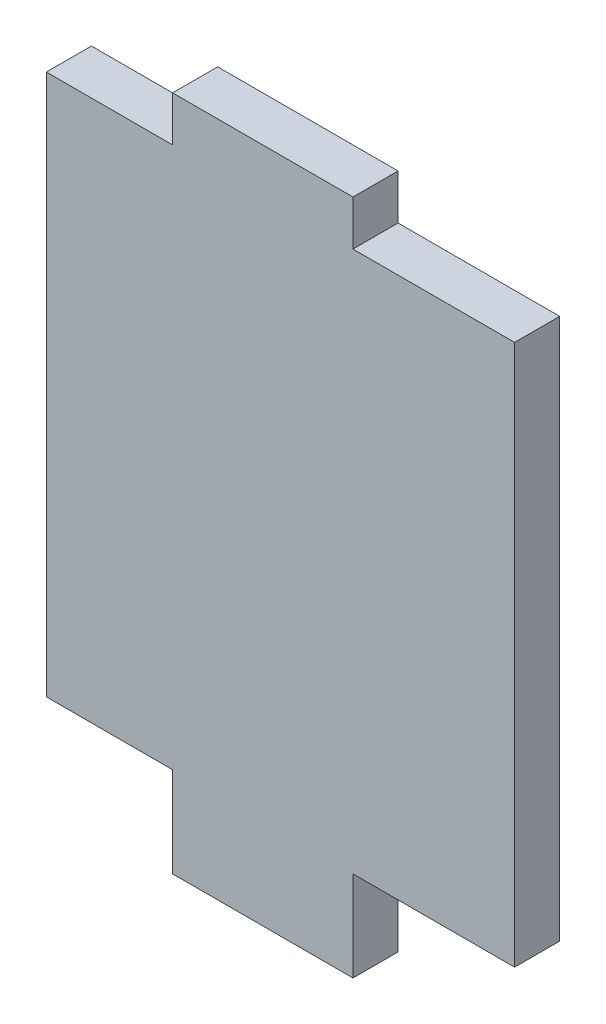
ISO-10303-21;
HEADER;
FILE_DESCRIPTION(('STEP AP214'),'2;1');
FILE_NAME('part.step','',(''),(''),'','','');
FILE_SCHEMA(('AUTOMOTIVE_DESIGN { 1 0 10303 214 1 1 1 1 }'));
ENDSEC;
DATA;
#1=APPLICATION_CONTEXT('core data for automotive mechanical design processes');
#2=APPLICATION_PROTOCOL_DEFINITION('international standard','automotive_design',2000,#1);
#3=PRODUCT_CONTEXT('',#1,'mechanical');
#4=PRODUCT('Part','Part','',(#3));
#5=PRODUCT_RELATED_PRODUCT_CATEGORY('part','',(#4));
#6=PRODUCT_DEFINITION_FORMATION('','',#4);
#7=PRODUCT_DEFINITION_CONTEXT('part definition',#1,'design');
#8=PRODUCT_DEFINITION('design','',#6,#7);
#9=PRODUCT_DEFINITION_SHAPE('','',#8);
#10=(LENGTH_UNIT() NAMED_UNIT(*) SI_UNIT(.MILLI.,.METRE.));
#11=(NAMED_UNIT(*) PLANE_ANGLE_UNIT() SI_UNIT($,.RADIAN.));
#12=(NAMED_UNIT(*) SI_UNIT($,.STERADIAN.) SOLID_ANGLE_UNIT());
#13=UNCERTAINTY_MEASURE_WITH_UNIT(LENGTH_MEASURE(1.E-05),#10,'distance_accuracy_value','');
#14=(GEOMETRIC_REPRESENTATION_CONTEXT(3) GLOBAL_UNCERTAINTY_ASSIGNED_CONTEXT((#13)) GLOBAL_UNIT_ASSIGNED_CONTEXT((#10,
#11,#12)) REPRESENTATION_CONTEXT('',''));
#15=CARTESIAN_POINT('',(0.,0.,0.));
#16=DIRECTION('',(0.,0.,1.));
#17=DIRECTION('',(1.,0.,0.));
#18=AXIS2_PLACEMENT_3D('',#15,#16,#17);
#19=CARTESIAN_POINT('',(-12.980754985,-13.75,2.5));
#20=DIRECTION('',(1.,0.,0.));
#21=DIRECTION('',(0.,0.,-1.));
#22=AXIS2_PLACEMENT_3D('',#19,#20,#21);
#23=PLANE('',#22);
#24=DIRECTION('',(0.,-1.,0.));
#25=VECTOR('',#24,1.);
#26=CARTESIAN_POINT('',(-12.980754985,-13.75,0.));
#27=LINE('',#26,#25);
#28=CARTESIAN_POINT('',(-12.980754985,16.25,0.));
#29=VERTEX_POINT('',#28);
#30=CARTESIAN_POINT('',(-12.980754985,-13.75,0.));
#31=VERTEX_POINT('',#30);
#32=EDGE_CURVE('E153',#29,#31,#27,.T.);
#33=ORIENTED_EDGE('',*,*,#32,.T.);
#34=DIRECTION('',(0.,0.,-1.));
#35=VECTOR('',#34,1.);
#36=CARTESIAN_POINT('',(-12.980754985,-13.75,2.5));
#37=LINE('',#36,#35);
#38=CARTESIAN_POINT('',(-12.980754985,-13.75,2.5));
#39=VERTEX_POINT('',#38);
#40=EDGE_CURVE('E11',#39,#31,#37,.T.);
#41=ORIENTED_EDGE('',*,*,#40,.F.);
#42=DIRECTION('',(0.,-1.,0.));
#43=VECTOR('',#42,1.);
#44=CARTESIAN_POINT('',(-12.980754985,-13.75,2.5));
#45=LINE('',#44,#43);
#46=CARTESIAN_POINT('',(-12.980754985,16.25,2.5));
#47=VERTEX_POINT('',#46);
#48=EDGE_CURVE('E175',#47,#39,#45,.T.);
#49=ORIENTED_EDGE('',*,*,#48,.F.);
#50=DIRECTION('',(0.,0.,-1.));
#51=VECTOR('',#50,1.);
#52=CARTESIAN_POINT('',(-12.980754985,16.25,2.5));
#53=LINE('',#52,#51);
#54=EDGE_CURVE('E149',#47,#29,#53,.T.);
#55=ORIENTED_EDGE('',*,*,#54,.T.);
#56=EDGE_LOOP('',(#33,#41,#49,#55));
#57=FACE_BOUND('',#56,.T.);
#58=ADVANCED_FACE('F33',(#57),#23,.F.);
#59=CARTESIAN_POINT('',(-5.980754985,-13.75,2.5));
#60=DIRECTION('',(0.,1.,0.));
#61=DIRECTION('',(-1.,0.,0.));
#62=AXIS2_PLACEMENT_3D('',#59,#60,#61);
#63=PLANE('',#62);
#64=DIRECTION('',(1.,0.,0.));
#65=VECTOR('',#64,1.);
#66=CARTESIAN_POINT('',(-5.980754985,-13.75,0.));
#67=LINE('',#66,#65);
#68=CARTESIAN_POINT('',(-5.980754985,-13.75,0.));
#69=VERTEX_POINT('',#68);
#70=EDGE_CURVE('E156',#31,#69,#67,.T.);
#71=ORIENTED_EDGE('',*,*,#70,.T.);
#72=DIRECTION('',(0.,0.,-1.));
#73=VECTOR('',#72,1.);
#74=CARTESIAN_POINT('',(-5.980754985,-13.75,2.5));
#75=LINE('',#74,#73);
#76=CARTESIAN_POINT('',(-5.980754985,-13.75,2.5));
#77=VERTEX_POINT('',#76);
#78=EDGE_CURVE('E41',#77,#69,#75,.T.);
#79=ORIENTED_EDGE('',*,*,#78,.F.);
#80=DIRECTION('',(1.,0.,0.));
#81=VECTOR('',#80,1.);
#82=CARTESIAN_POINT('',(-5.980754985,-13.75,2.5));
#83=LINE('',#82,#81);
#84=EDGE_CURVE('E104',#39,#77,#83,.T.);
#85=ORIENTED_EDGE('',*,*,#84,.F.);
#86=ORIENTED_EDGE('',*,*,#40,.T.);
#87=EDGE_LOOP('',(#71,#79,#85,#86));
#88=FACE_BOUND('',#87,.T.);
#89=ADVANCED_FACE('F253',(#88),#63,.F.);
#90=CARTESIAN_POINT('',(-5.980754985,-18.75,2.5));
#91=DIRECTION('',(1.,0.,0.));
#92=DIRECTION('',(0.,0.,-1.));
#93=AXIS2_PLACEMENT_3D('',#90,#91,#92);
#94=PLANE('',#93);
#95=DIRECTION('',(0.,-1.,0.));
#96=VECTOR('',#95,1.);
#97=CARTESIAN_POINT('',(-5.980754985,-18.75,0.));
#98=LINE('',#97,#96);
#99=CARTESIAN_POINT('',(-5.980754985,-18.75,0.));
#100=VERTEX_POINT('',#99);
#101=EDGE_CURVE('E158',#69,#100,#98,.T.);
#102=ORIENTED_EDGE('',*,*,#101,.T.);
#103=DIRECTION('',(0.,0.,-1.));
#104=VECTOR('',#103,1.);
#105=CARTESIAN_POINT('',(-5.980754985,-18.75,2.5));
#106=LINE('',#105,#104);
#107=CARTESIAN_POINT('',(-5.980754985,-18.75,2.5));
#108=VERTEX_POINT('',#107);
#109=EDGE_CURVE('E194',#108,#100,#106,.T.);
#110=ORIENTED_EDGE('',*,*,#109,.F.);
#111=DIRECTION('',(0.,-1.,0.));
#112=VECTOR('',#111,1.);
#113=CARTESIAN_POINT('',(-5.980754985,-18.75,2.5));
#114=LINE('',#113,#112);
#115=EDGE_CURVE('E202',#77,#108,#114,.T.);
#116=ORIENTED_EDGE('',*,*,#115,.F.);
#117=ORIENTED_EDGE('',*,*,#78,.T.);
#118=EDGE_LOOP('',(#102,#110,#116,#117));
#119=FACE_BOUND('',#118,.T.);
#120=ADVANCED_FACE('F200',(#119),#94,.F.);
#121=CARTESIAN_POINT('',(4.01924501500001,-18.75,2.5));
#122=DIRECTION('',(0.,1.,0.));
#123=DIRECTION('',(0.,0.,1.));
#124=AXIS2_PLACEMENT_3D('',#121,#122,#123);
#125=PLANE('',#124);
#126=DIRECTION('',(1.,0.,0.));
#127=VECTOR('',#126,1.);
#128=CARTESIAN_POINT('',(4.01924501500001,-18.75,0.));
#129=LINE('',#128,#127);
#130=CARTESIAN_POINT('',(4.01924501500001,-18.75,0.));
#131=VERTEX_POINT('',#130);
#132=EDGE_CURVE('E160',#100,#131,#129,.T.);
#133=ORIENTED_EDGE('',*,*,#132,.T.);
#134=DIRECTION('',(0.,0.,-1.));
#135=VECTOR('',#134,1.);
#136=CARTESIAN_POINT('',(4.01924501500001,-18.75,2.5));
#137=LINE('',#136,#135);
#138=CARTESIAN_POINT('',(4.01924501500001,-18.75,2.5));
#139=VERTEX_POINT('',#138);
#140=EDGE_CURVE('E191',#139,#131,#137,.T.);
#141=ORIENTED_EDGE('',*,*,#140,.F.);
#142=DIRECTION('',(1.,0.,0.));
#143=VECTOR('',#142,1.);
#144=CARTESIAN_POINT('',(4.01924501500001,-18.75,2.5));
#145=LINE('',#144,#143);
#146=EDGE_CURVE('E220',#108,#139,#145,.T.);
#147=ORIENTED_EDGE('',*,*,#146,.F.);
#148=ORIENTED_EDGE('',*,*,#109,.T.);
#149=EDGE_LOOP('',(#133,#141,#147,#148));
#150=FACE_BOUND('',#149,.T.);
#151=ADVANCED_FACE('F211',(#150),#125,.F.);
#152=CARTESIAN_POINT('',(4.01924501500001,-13.75,2.5));
#153=DIRECTION('',(-1.,0.,0.));
#154=DIRECTION('',(0.,-1.,0.));
#155=AXIS2_PLACEMENT_3D('',#152,#153,#154);
#156=PLANE('',#155);
#157=DIRECTION('',(0.,1.,0.));
#158=VECTOR('',#157,1.);
#159=CARTESIAN_POINT('',(4.01924501500001,-13.75,0.));
#160=LINE('',#159,#158);
#161=CARTESIAN_POINT('',(4.01924501500001,-13.75,0.));
#162=VERTEX_POINT('',#161);
#163=EDGE_CURVE('E162',#131,#162,#160,.T.);
#164=ORIENTED_EDGE('',*,*,#163,.T.);
#165=DIRECTION('',(0.,0.,-1.));
#166=VECTOR('',#165,1.);
#167=CARTESIAN_POINT('',(4.01924501500001,-13.75,2.5));
#168=LINE('',#167,#166);
#169=CARTESIAN_POINT('',(4.01924501500001,-13.75,2.5));
#170=VERTEX_POINT('',#169);
#171=EDGE_CURVE('E188',#170,#162,#168,.T.);
#172=ORIENTED_EDGE('',*,*,#171,.F.);
#173=DIRECTION('',(0.,1.,0.));
#174=VECTOR('',#173,1.);
#175=CARTESIAN_POINT('',(4.01924501500001,-13.75,2.5));
#176=LINE('',#175,#174);
#177=EDGE_CURVE('E217',#139,#170,#176,.T.);
#178=ORIENTED_EDGE('',*,*,#177,.F.);
#179=ORIENTED_EDGE('',*,*,#140,.T.);
#180=EDGE_LOOP('',(#164,#172,#178,#179));
#181=FACE_BOUND('',#180,.T.);
#182=ADVANCED_FACE('F215',(#181),#156,.F.);
#183=CARTESIAN_POINT('',(12.980754985,-13.75,2.5));
#184=DIRECTION('',(0.,1.,0.));
#185=DIRECTION('',(0.,0.,1.));
#186=AXIS2_PLACEMENT_3D('',#183,#184,#185);
#187=PLANE('',#186);
#188=DIRECTION('',(1.,0.,0.));
#189=VECTOR('',#188,1.);
#190=CARTESIAN_POINT('',(12.980754985,-13.75,0.));
#191=LINE('',#190,#189);
#192=CARTESIAN_POINT('',(12.980754985,-13.75,0.));
#193=VERTEX_POINT('',#192);
#194=EDGE_CURVE('E164',#162,#193,#191,.T.);
#195=ORIENTED_EDGE('',*,*,#194,.T.);
#196=DIRECTION('',(0.,0.,-1.));
#197=VECTOR('',#196,1.);
#198=CARTESIAN_POINT('',(12.980754985,-13.75,2.5));
#199=LINE('',#198,#197);
#200=CARTESIAN_POINT('',(12.980754985,-13.75,2.5));
#201=VERTEX_POINT('',#200);
#202=EDGE_CURVE('E185',#201,#193,#199,.T.);
#203=ORIENTED_EDGE('',*,*,#202,.F.);
#204=DIRECTION('',(1.,0.,0.));
#205=VECTOR('',#204,1.);
#206=CARTESIAN_POINT('',(12.980754985,-13.75,2.5));
#207=LINE('',#206,#205);
#208=EDGE_CURVE('E219',#170,#201,#207,.T.);
#209=ORIENTED_EDGE('',*,*,#208,.F.);
#210=ORIENTED_EDGE('',*,*,#171,.T.);
#211=EDGE_LOOP('',(#195,#203,#209,#210));
#212=FACE_BOUND('',#211,.T.);
#213=ADVANCED_FACE('F266',(#212),#187,.F.);
#214=CARTESIAN_POINT('',(12.980754985,16.25,2.5));
#215=DIRECTION('',(-1.,0.,0.));
#216=DIRECTION('',(0.,0.,1.));
#217=AXIS2_PLACEMENT_3D('',#214,#215,#216);
#218=PLANE('',#217);
#219=DIRECTION('',(0.,1.,0.));
#220=VECTOR('',#219,1.);
#221=CARTESIAN_POINT('',(12.980754985,16.25,0.));
#222=LINE('',#221,#220);
#223=CARTESIAN_POINT('',(12.980754985,16.25,0.));
#224=VERTEX_POINT('',#223);
#225=EDGE_CURVE('E166',#193,#224,#222,.T.);
#226=ORIENTED_EDGE('',*,*,#225,.T.);
#227=DIRECTION('',(0.,0.,-1.));
#228=VECTOR('',#227,1.);
#229=CARTESIAN_POINT('',(12.980754985,16.25,2.5));
#230=LINE('',#229,#228);
#231=CARTESIAN_POINT('',(12.980754985,16.25,2.5));
#232=VERTEX_POINT('',#231);
#233=EDGE_CURVE('E182',#232,#224,#230,.T.);
#234=ORIENTED_EDGE('',*,*,#233,.F.);
#235=DIRECTION('',(0.,1.,0.));
#236=VECTOR('',#235,1.);
#237=CARTESIAN_POINT('',(12.980754985,16.25,2.5));
#238=LINE('',#237,#236);
#239=EDGE_CURVE('E222',#201,#232,#238,.T.);
#240=ORIENTED_EDGE('',*,*,#239,.F.);
#241=ORIENTED_EDGE('',*,*,#202,.T.);
#242=EDGE_LOOP('',(#226,#234,#240,#241));
#243=FACE_BOUND('',#242,.T.);
#244=ADVANCED_FACE('F269',(#243),#218,.F.);
#245=CARTESIAN_POINT('',(4.019245015,16.25,2.5));
#246=DIRECTION('',(0.,-1.,0.));
#247=DIRECTION('',(0.,0.,-1.));
#248=AXIS2_PLACEMENT_3D('',#245,#246,#247);
#249=PLANE('',#248);
#250=DIRECTION('',(-1.,0.,0.));
#251=VECTOR('',#250,1.);
#252=CARTESIAN_POINT('',(4.019245015,16.25,0.));
#253=LINE('',#252,#251);
#254=CARTESIAN_POINT('',(4.019245015,16.25,0.));
#255=VERTEX_POINT('',#254);
#256=EDGE_CURVE('E168',#224,#255,#253,.T.);
#257=ORIENTED_EDGE('',*,*,#256,.T.);
#258=DIRECTION('',(0.,0.,-1.));
#259=VECTOR('',#258,1.);
#260=CARTESIAN_POINT('',(4.019245015,16.25,2.5));
#261=LINE('',#260,#259);
#262=CARTESIAN_POINT('',(4.019245015,16.25,2.5));
#263=VERTEX_POINT('',#262);
#264=EDGE_CURVE('E179',#263,#255,#261,.T.);
#265=ORIENTED_EDGE('',*,*,#264,.F.);
#266=DIRECTION('',(-1.,0.,0.));
#267=VECTOR('',#266,1.);
#268=CARTESIAN_POINT('',(4.019245015,16.25,2.5));
#269=LINE('',#268,#267);
#270=EDGE_CURVE('E228',#232,#263,#269,.T.);
#271=ORIENTED_EDGE('',*,*,#270,.F.);
#272=ORIENTED_EDGE('',*,*,#233,.T.);
#273=EDGE_LOOP('',(#257,#265,#271,#272));
#274=FACE_BOUND('',#273,.T.);
#275=ADVANCED_FACE('F234',(#274),#249,.F.);
#276=CARTESIAN_POINT('',(4.01924501500001,18.75,2.5));
#277=DIRECTION('',(-1.,0.,0.));
#278=DIRECTION('',(0.,-1.,0.));
#279=AXIS2_PLACEMENT_3D('',#276,#277,#278);
#280=PLANE('',#279);
#281=DIRECTION('',(0.,1.,0.));
#282=VECTOR('',#281,1.);
#283=CARTESIAN_POINT('',(4.01924501500001,18.75,0.));
#284=LINE('',#283,#282);
#285=CARTESIAN_POINT('',(4.01924501500001,18.75,0.));
#286=VERTEX_POINT('',#285);
#287=EDGE_CURVE('E170',#255,#286,#284,.T.);
#288=ORIENTED_EDGE('',*,*,#287,.T.);
#289=DIRECTION('',(0.,0.,-1.));
#290=VECTOR('',#289,1.);
#291=CARTESIAN_POINT('',(4.01924501500001,18.75,2.5));
#292=LINE('',#291,#290);
#293=CARTESIAN_POINT('',(4.01924501500001,18.75,2.5));
#294=VERTEX_POINT('',#293);
#295=EDGE_CURVE('E144',#294,#286,#292,.T.);
#296=ORIENTED_EDGE('',*,*,#295,.F.);
#297=DIRECTION('',(0.,1.,0.));
#298=VECTOR('',#297,1.);
#299=CARTESIAN_POINT('',(4.01924501500001,18.75,2.5));
#300=LINE('',#299,#298);
#301=EDGE_CURVE('E135',#263,#294,#300,.T.);
#302=ORIENTED_EDGE('',*,*,#301,.F.);
#303=ORIENTED_EDGE('',*,*,#264,.T.);
#304=EDGE_LOOP('',(#288,#296,#302,#303));
#305=FACE_BOUND('',#304,.T.);
#306=ADVANCED_FACE('F238',(#305),#280,.F.);
#307=CARTESIAN_POINT('',(-5.980754985,18.75,2.5));
#308=DIRECTION('',(0.,-1.,0.));
#309=DIRECTION('',(0.,0.,-1.));
#310=AXIS2_PLACEMENT_3D('',#307,#308,#309);
#311=PLANE('',#310);
#312=DIRECTION('',(-1.,0.,0.));
#313=VECTOR('',#312,1.);
#314=CARTESIAN_POINT('',(-5.980754985,18.75,0.));
#315=LINE('',#314,#313);
#316=CARTESIAN_POINT('',(-5.980754985,18.75,0.));
#317=VERTEX_POINT('',#316);
#318=EDGE_CURVE('E143',#286,#317,#315,.T.);
#319=ORIENTED_EDGE('',*,*,#318,.T.);
#320=DIRECTION('',(0.,0.,-1.));
#321=VECTOR('',#320,1.);
#322=CARTESIAN_POINT('',(-5.980754985,18.75,2.5));
#323=LINE('',#322,#321);
#324=CARTESIAN_POINT('',(-5.980754985,18.75,2.5));
#325=VERTEX_POINT('',#324);
#326=EDGE_CURVE('E140',#325,#317,#323,.T.);
#327=ORIENTED_EDGE('',*,*,#326,.F.);
#328=DIRECTION('',(-1.,0.,0.));
#329=VECTOR('',#328,1.);
#330=CARTESIAN_POINT('',(-5.980754985,18.75,2.5));
#331=LINE('',#330,#329);
#332=EDGE_CURVE('E129',#294,#325,#331,.T.);
#333=ORIENTED_EDGE('',*,*,#332,.F.);
#334=ORIENTED_EDGE('',*,*,#295,.T.);
#335=EDGE_LOOP('',(#319,#327,#333,#334));
#336=FACE_BOUND('',#335,.T.);
#337=ADVANCED_FACE('F141',(#336),#311,.F.);
#338=CARTESIAN_POINT('',(-5.980754985,16.25,2.5));
#339=DIRECTION('',(1.,0.,0.));
#340=DIRECTION('',(0.,0.,-1.));
#341=AXIS2_PLACEMENT_3D('',#338,#339,#340);
#342=PLANE('',#341);
#343=DIRECTION('',(0.,-1.,0.));
#344=VECTOR('',#343,1.);
#345=CARTESIAN_POINT('',(-5.980754985,16.25,0.));
#346=LINE('',#345,#344);
#347=CARTESIAN_POINT('',(-5.980754985,16.25,0.));
#348=VERTEX_POINT('',#347);
#349=EDGE_CURVE('E90',#317,#348,#346,.T.);
#350=ORIENTED_EDGE('',*,*,#349,.T.);
#351=DIRECTION('',(0.,0.,-1.));
#352=VECTOR('',#351,1.);
#353=CARTESIAN_POINT('',(-5.980754985,16.25,2.5));
#354=LINE('',#353,#352);
#355=CARTESIAN_POINT('',(-5.980754985,16.25,2.5));
#356=VERTEX_POINT('',#355);
#357=EDGE_CURVE('E145',#356,#348,#354,.T.);
#358=ORIENTED_EDGE('',*,*,#357,.F.);
#359=DIRECTION('',(0.,-1.,0.));
#360=VECTOR('',#359,1.);
#361=CARTESIAN_POINT('',(-5.980754985,16.25,2.5));
#362=LINE('',#361,#360);
#363=EDGE_CURVE('E133',#325,#356,#362,.T.);
#364=ORIENTED_EDGE('',*,*,#363,.F.);
#365=ORIENTED_EDGE('',*,*,#326,.T.);
#366=EDGE_LOOP('',(#350,#358,#364,#365));
#367=FACE_BOUND('',#366,.T.);
#368=ADVANCED_FACE('F147',(#367),#342,.F.);
#369=CARTESIAN_POINT('',(-12.980754985,16.25,2.5));
#370=DIRECTION('',(0.,-1.,0.));
#371=DIRECTION('',(0.,0.,-1.));
#372=AXIS2_PLACEMENT_3D('',#369,#370,#371);
#373=PLANE('',#372);
#374=DIRECTION('',(-1.,0.,0.));
#375=VECTOR('',#374,1.);
#376=CARTESIAN_POINT('',(-12.980754985,16.25,0.));
#377=LINE('',#376,#375);
#378=EDGE_CURVE('E96',#348,#29,#377,.T.);
#379=ORIENTED_EDGE('',*,*,#378,.T.);
#380=ORIENTED_EDGE('',*,*,#54,.F.);
#381=DIRECTION('',(-1.,0.,0.));
#382=VECTOR('',#381,1.);
#383=CARTESIAN_POINT('',(-12.980754985,16.25,2.5));
#384=LINE('',#383,#382);
#385=EDGE_CURVE('E49',#356,#47,#384,.T.);
#386=ORIENTED_EDGE('',*,*,#385,.F.);
#387=ORIENTED_EDGE('',*,*,#357,.T.);
#388=EDGE_LOOP('',(#379,#380,#386,#387));
#389=FACE_BOUND('',#388,.T.);
#390=ADVANCED_FACE('F242',(#389),#373,.F.);
#391=CARTESIAN_POINT('',(0.,0.,2.5));
#392=DIRECTION('',(0.,0.,-1.));
#393=DIRECTION('',(-1.,0.,0.));
#394=AXIS2_PLACEMENT_3D('',#391,#392,#393);
#395=PLANE('',#394);
#396=ORIENTED_EDGE('',*,*,#48,.T.);
#397=ORIENTED_EDGE('',*,*,#84,.T.);
#398=ORIENTED_EDGE('',*,*,#115,.T.);
#399=ORIENTED_EDGE('',*,*,#146,.T.);
#400=ORIENTED_EDGE('',*,*,#177,.T.);
#401=ORIENTED_EDGE('',*,*,#208,.T.);
#402=ORIENTED_EDGE('',*,*,#239,.T.);
#403=ORIENTED_EDGE('',*,*,#270,.T.);
#404=ORIENTED_EDGE('',*,*,#301,.T.);
#405=ORIENTED_EDGE('',*,*,#332,.T.);
#406=ORIENTED_EDGE('',*,*,#363,.T.);
#407=ORIENTED_EDGE('',*,*,#385,.T.);
#408=EDGE_LOOP('',(#396,#397,#398,#399,#400,#401,#402,#403,#404,#405,#406,#407));
#409=FACE_BOUND('',#408,.T.);
#410=ADVANCED_FACE('F131',(#409),#395,.F.);
#411=CARTESIAN_POINT('',(0.,0.,0.));
#412=DIRECTION('',(0.,0.,-1.));
#413=DIRECTION('',(-1.,0.,0.));
#414=AXIS2_PLACEMENT_3D('',#411,#412,#413);
#415=PLANE('',#414);
#416=ORIENTED_EDGE('',*,*,#32,.F.);
#417=ORIENTED_EDGE('',*,*,#378,.F.);
#418=ORIENTED_EDGE('',*,*,#349,.F.);
#419=ORIENTED_EDGE('',*,*,#318,.F.);
#420=ORIENTED_EDGE('',*,*,#287,.F.);
#421=ORIENTED_EDGE('',*,*,#256,.F.);
#422=ORIENTED_EDGE('',*,*,#225,.F.);
#423=ORIENTED_EDGE('',*,*,#194,.F.);
#424=ORIENTED_EDGE('',*,*,#163,.F.);
#425=ORIENTED_EDGE('',*,*,#132,.F.);
#426=ORIENTED_EDGE('',*,*,#101,.F.);
#427=ORIENTED_EDGE('',*,*,#70,.F.);
#428=EDGE_LOOP('',(#416,#417,#418,#419,#420,#421,#422,#423,#424,#425,#426,#427));
#429=FACE_BOUND('',#428,.T.);
#430=ADVANCED_FACE('F206',(#429),#415,.T.);
#431=CLOSED_SHELL('',(#58,#89,#120,#151,#182,#213,#244,#275,#306,#337,#368,#390,#410,#430));
#432=MANIFOLD_SOLID_BREP('B2',#431);
#433=ADVANCED_BREP_SHAPE_REPRESENTATION('',(#18,#432),#14);
#434=SHAPE_DEFINITION_REPRESENTATION(#9,#433);
ENDSEC;
END-ISO-10303-21;
